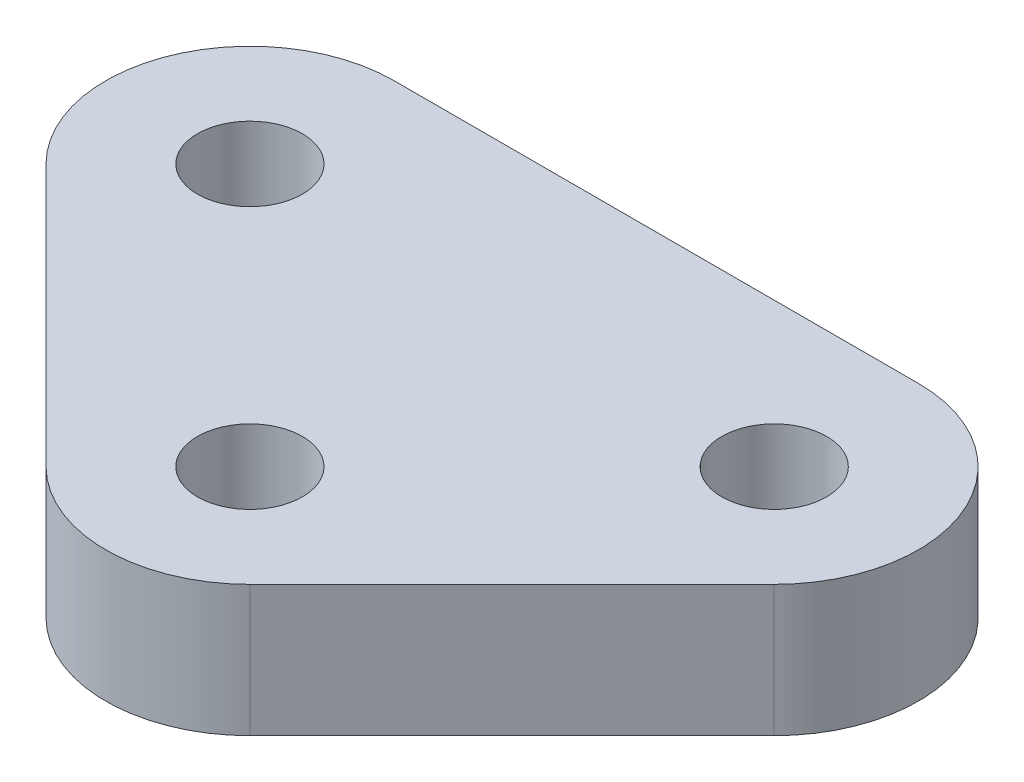
ISO-10303-21;
HEADER;
FILE_DESCRIPTION(('STEP AP214'),'2;1');
FILE_NAME('part.step','',(''),(''),'','','');
FILE_SCHEMA(('AUTOMOTIVE_DESIGN { 1 0 10303 214 1 1 1 1 }'));
ENDSEC;
DATA;
#1=APPLICATION_CONTEXT('core data for automotive mechanical design processes');
#2=APPLICATION_PROTOCOL_DEFINITION('international standard','automotive_design',2000,#1);
#3=PRODUCT_CONTEXT('',#1,'mechanical');
#4=PRODUCT('Part','Part','',(#3));
#5=PRODUCT_RELATED_PRODUCT_CATEGORY('part','',(#4));
#6=PRODUCT_DEFINITION_FORMATION('','',#4);
#7=PRODUCT_DEFINITION_CONTEXT('part definition',#1,'design');
#8=PRODUCT_DEFINITION('design','',#6,#7);
#9=PRODUCT_DEFINITION_SHAPE('','',#8);
#10=(LENGTH_UNIT() NAMED_UNIT(*) SI_UNIT(.MILLI.,.METRE.));
#11=(NAMED_UNIT(*) PLANE_ANGLE_UNIT() SI_UNIT($,.RADIAN.));
#12=(NAMED_UNIT(*) SI_UNIT($,.STERADIAN.) SOLID_ANGLE_UNIT());
#13=UNCERTAINTY_MEASURE_WITH_UNIT(LENGTH_MEASURE(1.E-05),#10,'distance_accuracy_value','');
#14=(GEOMETRIC_REPRESENTATION_CONTEXT(3) GLOBAL_UNCERTAINTY_ASSIGNED_CONTEXT((#13)) GLOBAL_UNIT_ASSIGNED_CONTEXT((#10,
#11,#12)) REPRESENTATION_CONTEXT('',''));
#15=CARTESIAN_POINT('',(0.,0.,0.));
#16=DIRECTION('',(0.,0.,1.));
#17=DIRECTION('',(1.,0.,0.));
#18=AXIS2_PLACEMENT_3D('',#15,#16,#17);
#19=CARTESIAN_POINT('',(-10.,5.,0.));
#20=DIRECTION('',(0.,-1.,0.));
#21=DIRECTION('',(0.,0.,-1.));
#22=AXIS2_PLACEMENT_3D('',#19,#20,#21);
#23=PLANE('',#22);
#24=CARTESIAN_POINT('',(-10.,5.,0.));
#25=DIRECTION('',(0.,1.,0.));
#26=DIRECTION('',(0.,0.,-1.));
#27=AXIS2_PLACEMENT_3D('',#24,#25,#26);
#28=CIRCLE('',#27,5.5);
#29=CARTESIAN_POINT('',(-10.,5.,-5.5));
#30=VERTEX_POINT('',#29);
#31=CARTESIAN_POINT('',(-13.889087296526,5.,3.88908729652601));
#32=VERTEX_POINT('',#31);
#33=EDGE_CURVE('E131',#30,#32,#28,.T.);
#34=ORIENTED_EDGE('',*,*,#33,.T.);
#35=DIRECTION('',(0.707106781186547,0.,0.707106781186548));
#36=VECTOR('',#35,1.);
#37=CARTESIAN_POINT('',(-3.88908729652601,5.,13.889087296526));
#38=LINE('',#37,#36);
#39=CARTESIAN_POINT('',(-3.88908729652601,5.,13.889087296526));
#40=VERTEX_POINT('',#39);
#41=EDGE_CURVE('E89',#32,#40,#38,.T.);
#42=ORIENTED_EDGE('',*,*,#41,.T.);
#43=CARTESIAN_POINT('',(0.,5.,10.));
#44=DIRECTION('',(0.,1.,0.));
#45=DIRECTION('',(0.,0.,-1.));
#46=AXIS2_PLACEMENT_3D('',#43,#44,#45);
#47=CIRCLE('',#46,5.5);
#48=CARTESIAN_POINT('',(3.88908729652601,5.,13.889087296526));
#49=VERTEX_POINT('',#48);
#50=EDGE_CURVE('E102',#40,#49,#47,.T.);
#51=ORIENTED_EDGE('',*,*,#50,.T.);
#52=DIRECTION('',(0.707106781186547,0.,-0.707106781186548));
#53=VECTOR('',#52,1.);
#54=CARTESIAN_POINT('',(13.889087296526,5.,3.88908729652601));
#55=LINE('',#54,#53);
#56=CARTESIAN_POINT('',(13.889087296526,5.,3.88908729652601));
#57=VERTEX_POINT('',#56);
#58=EDGE_CURVE('E96',#49,#57,#55,.T.);
#59=ORIENTED_EDGE('',*,*,#58,.T.);
#60=CARTESIAN_POINT('',(10.,5.,0.));
#61=DIRECTION('',(0.,1.,0.));
#62=DIRECTION('',(0.,0.,-1.));
#63=AXIS2_PLACEMENT_3D('',#60,#61,#62);
#64=CIRCLE('',#63,5.5);
#65=CARTESIAN_POINT('',(10.,5.,-5.5));
#66=VERTEX_POINT('',#65);
#67=EDGE_CURVE('E100',#57,#66,#64,.T.);
#68=ORIENTED_EDGE('',*,*,#67,.T.);
#69=DIRECTION('',(-1.,0.,0.));
#70=VECTOR('',#69,1.);
#71=CARTESIAN_POINT('',(-10.,5.,-5.5));
#72=LINE('',#71,#70);
#73=EDGE_CURVE('E52',#66,#30,#72,.T.);
#74=ORIENTED_EDGE('',*,*,#73,.T.);
#75=EDGE_LOOP('',(#34,#42,#51,#59,#68,#74));
#76=FACE_BOUND('',#75,.T.);
#77=CARTESIAN_POINT('',(-10.,5.,0.));
#78=DIRECTION('',(0.,1.,0.));
#79=DIRECTION('',(0.,0.,1.));
#80=AXIS2_PLACEMENT_3D('',#77,#78,#79);
#81=CIRCLE('',#80,2.);
#82=CARTESIAN_POINT('',(-10.,5.,2.));
#83=VERTEX_POINT('',#82);
#84=EDGE_CURVE('E124',#83,#83,#81,.T.);
#85=ORIENTED_EDGE('',*,*,#84,.F.);
#86=EDGE_LOOP('',(#85));
#87=FACE_BOUND('',#86,.T.);
#88=CARTESIAN_POINT('',(10.,5.,0.));
#89=DIRECTION('',(0.,1.,0.));
#90=DIRECTION('',(0.,0.,1.));
#91=AXIS2_PLACEMENT_3D('',#88,#89,#90);
#92=CIRCLE('',#91,2.);
#93=CARTESIAN_POINT('',(10.,5.,2.));
#94=VERTEX_POINT('',#93);
#95=EDGE_CURVE('E185',#94,#94,#92,.T.);
#96=ORIENTED_EDGE('',*,*,#95,.F.);
#97=EDGE_LOOP('',(#96));
#98=FACE_BOUND('',#97,.T.);
#99=CARTESIAN_POINT('',(0.,5.,10.));
#100=DIRECTION('',(0.,1.,0.));
#101=DIRECTION('',(0.,0.,1.));
#102=AXIS2_PLACEMENT_3D('',#99,#100,#101);
#103=CIRCLE('',#102,2.);
#104=CARTESIAN_POINT('',(0.,5.,12.));
#105=VERTEX_POINT('',#104);
#106=EDGE_CURVE('E176',#105,#105,#103,.T.);
#107=ORIENTED_EDGE('',*,*,#106,.F.);
#108=EDGE_LOOP('',(#107));
#109=FACE_BOUND('',#108,.T.);
#110=ADVANCED_FACE('F35',(#76,#87,#98,#109),#23,.F.);
#111=CARTESIAN_POINT('',(-10.,0.,0.));
#112=DIRECTION('',(0.,-1.,0.));
#113=DIRECTION('',(0.,0.,-1.));
#114=AXIS2_PLACEMENT_3D('',#111,#112,#113);
#115=PLANE('',#114);
#116=CARTESIAN_POINT('',(10.,0.,0.));
#117=DIRECTION('',(0.,1.,0.));
#118=DIRECTION('',(0.,0.,1.));
#119=AXIS2_PLACEMENT_3D('',#116,#117,#118);
#120=CIRCLE('',#119,2.);
#121=CARTESIAN_POINT('',(10.,0.,2.));
#122=VERTEX_POINT('',#121);
#123=EDGE_CURVE('E182',#122,#122,#120,.T.);
#124=ORIENTED_EDGE('',*,*,#123,.T.);
#125=EDGE_LOOP('',(#124));
#126=FACE_BOUND('',#125,.T.);
#127=CARTESIAN_POINT('',(-10.,0.,0.));
#128=DIRECTION('',(0.,1.,0.));
#129=DIRECTION('',(0.,0.,-1.));
#130=AXIS2_PLACEMENT_3D('',#127,#128,#129);
#131=CIRCLE('',#130,5.5);
#132=CARTESIAN_POINT('',(-10.,0.,-5.5));
#133=VERTEX_POINT('',#132);
#134=CARTESIAN_POINT('',(-13.889087296526,0.,3.88908729652601));
#135=VERTEX_POINT('',#134);
#136=EDGE_CURVE('E120',#133,#135,#131,.T.);
#137=ORIENTED_EDGE('',*,*,#136,.F.);
#138=DIRECTION('',(-1.,0.,0.));
#139=VECTOR('',#138,1.);
#140=CARTESIAN_POINT('',(-10.,0.,-5.5));
#141=LINE('',#140,#139);
#142=CARTESIAN_POINT('',(10.,0.,-5.5));
#143=VERTEX_POINT('',#142);
#144=EDGE_CURVE('E81',#143,#133,#141,.T.);
#145=ORIENTED_EDGE('',*,*,#144,.F.);
#146=CARTESIAN_POINT('',(10.,0.,0.));
#147=DIRECTION('',(0.,1.,0.));
#148=DIRECTION('',(0.,0.,-1.));
#149=AXIS2_PLACEMENT_3D('',#146,#147,#148);
#150=CIRCLE('',#149,5.5);
#151=CARTESIAN_POINT('',(13.889087296526,0.,3.88908729652601));
#152=VERTEX_POINT('',#151);
#153=EDGE_CURVE('E75',#152,#143,#150,.T.);
#154=ORIENTED_EDGE('',*,*,#153,.F.);
#155=DIRECTION('',(0.707106781186547,0.,-0.707106781186548));
#156=VECTOR('',#155,1.);
#157=CARTESIAN_POINT('',(13.889087296526,0.,3.88908729652601));
#158=LINE('',#157,#156);
#159=CARTESIAN_POINT('',(3.88908729652601,0.,13.889087296526));
#160=VERTEX_POINT('',#159);
#161=EDGE_CURVE('E110',#160,#152,#158,.T.);
#162=ORIENTED_EDGE('',*,*,#161,.F.);
#163=CARTESIAN_POINT('',(0.,0.,10.));
#164=DIRECTION('',(0.,1.,0.));
#165=DIRECTION('',(0.,0.,-1.));
#166=AXIS2_PLACEMENT_3D('',#163,#164,#165);
#167=CIRCLE('',#166,5.5);
#168=CARTESIAN_POINT('',(-3.88908729652601,0.,13.889087296526));
#169=VERTEX_POINT('',#168);
#170=EDGE_CURVE('E126',#169,#160,#167,.T.);
#171=ORIENTED_EDGE('',*,*,#170,.F.);
#172=DIRECTION('',(0.707106781186547,0.,0.707106781186548));
#173=VECTOR('',#172,1.);
#174=CARTESIAN_POINT('',(-3.88908729652601,0.,13.889087296526));
#175=LINE('',#174,#173);
#176=EDGE_CURVE('E123',#135,#169,#175,.T.);
#177=ORIENTED_EDGE('',*,*,#176,.F.);
#178=EDGE_LOOP('',(#137,#145,#154,#162,#171,#177));
#179=FACE_BOUND('',#178,.T.);
#180=CARTESIAN_POINT('',(-10.,0.,0.));
#181=DIRECTION('',(0.,1.,0.));
#182=DIRECTION('',(0.,0.,1.));
#183=AXIS2_PLACEMENT_3D('',#180,#181,#182);
#184=CIRCLE('',#183,2.);
#185=CARTESIAN_POINT('',(-10.,0.,2.));
#186=VERTEX_POINT('',#185);
#187=EDGE_CURVE('E188',#186,#186,#184,.T.);
#188=ORIENTED_EDGE('',*,*,#187,.T.);
#189=EDGE_LOOP('',(#188));
#190=FACE_BOUND('',#189,.T.);
#191=CARTESIAN_POINT('',(0.,0.,10.));
#192=DIRECTION('',(0.,1.,0.));
#193=DIRECTION('',(0.,0.,1.));
#194=AXIS2_PLACEMENT_3D('',#191,#192,#193);
#195=CIRCLE('',#194,2.);
#196=CARTESIAN_POINT('',(0.,0.,12.));
#197=VERTEX_POINT('',#196);
#198=EDGE_CURVE('E179',#197,#197,#195,.T.);
#199=ORIENTED_EDGE('',*,*,#198,.T.);
#200=EDGE_LOOP('',(#199));
#201=FACE_BOUND('',#200,.T.);
#202=ADVANCED_FACE('F140',(#126,#179,#190,#201),#115,.T.);
#203=CARTESIAN_POINT('',(-10.,5.,0.));
#204=DIRECTION('',(0.,-1.,0.));
#205=DIRECTION('',(0.,0.,-1.));
#206=AXIS2_PLACEMENT_3D('',#203,#204,#205);
#207=CYLINDRICAL_SURFACE('',#206,5.5);
#208=ORIENTED_EDGE('',*,*,#136,.T.);
#209=DIRECTION('',(0.,-1.,0.));
#210=VECTOR('',#209,1.);
#211=CARTESIAN_POINT('',(-13.889087296526,5.,3.88908729652601));
#212=LINE('',#211,#210);
#213=EDGE_CURVE('E11',#32,#135,#212,.T.);
#214=ORIENTED_EDGE('',*,*,#213,.F.);
#215=ORIENTED_EDGE('',*,*,#33,.F.);
#216=DIRECTION('',(0.,-1.,0.));
#217=VECTOR('',#216,1.);
#218=CARTESIAN_POINT('',(-10.,5.,-5.5));
#219=LINE('',#218,#217);
#220=EDGE_CURVE('E116',#30,#133,#219,.T.);
#221=ORIENTED_EDGE('',*,*,#220,.T.);
#222=EDGE_LOOP('',(#208,#214,#215,#221));
#223=FACE_BOUND('',#222,.T.);
#224=ADVANCED_FACE('F37',(#223),#207,.T.);
#225=CARTESIAN_POINT('',(-3.88908729652601,5.,13.889087296526));
#226=DIRECTION('',(0.707106781186548,0.,-0.707106781186547));
#227=DIRECTION('',(-0.707106781186547,0.,-0.707106781186548));
#228=AXIS2_PLACEMENT_3D('',#225,#226,#227);
#229=PLANE('',#228);
#230=ORIENTED_EDGE('',*,*,#176,.T.);
#231=DIRECTION('',(0.,-1.,0.));
#232=VECTOR('',#231,1.);
#233=CARTESIAN_POINT('',(-3.88908729652601,5.,13.889087296526));
#234=LINE('',#233,#232);
#235=EDGE_CURVE('E44',#40,#169,#234,.T.);
#236=ORIENTED_EDGE('',*,*,#235,.F.);
#237=ORIENTED_EDGE('',*,*,#41,.F.);
#238=ORIENTED_EDGE('',*,*,#213,.T.);
#239=EDGE_LOOP('',(#230,#236,#237,#238));
#240=FACE_BOUND('',#239,.T.);
#241=ADVANCED_FACE('F239',(#240),#229,.F.);
#242=CARTESIAN_POINT('',(0.,5.,10.));
#243=DIRECTION('',(0.,-1.,0.));
#244=DIRECTION('',(0.,0.,-1.));
#245=AXIS2_PLACEMENT_3D('',#242,#243,#244);
#246=CYLINDRICAL_SURFACE('',#245,5.5);
#247=ORIENTED_EDGE('',*,*,#170,.T.);
#248=DIRECTION('',(0.,-1.,0.));
#249=VECTOR('',#248,1.);
#250=CARTESIAN_POINT('',(3.88908729652601,5.,13.889087296526));
#251=LINE('',#250,#249);
#252=EDGE_CURVE('E111',#49,#160,#251,.T.);
#253=ORIENTED_EDGE('',*,*,#252,.F.);
#254=ORIENTED_EDGE('',*,*,#50,.F.);
#255=ORIENTED_EDGE('',*,*,#235,.T.);
#256=EDGE_LOOP('',(#247,#253,#254,#255));
#257=FACE_BOUND('',#256,.T.);
#258=ADVANCED_FACE('F137',(#257),#246,.T.);
#259=CARTESIAN_POINT('',(13.889087296526,5.,3.88908729652601));
#260=DIRECTION('',(-0.707106781186548,0.,-0.707106781186547));
#261=DIRECTION('',(-0.707106781186547,0.,0.707106781186548));
#262=AXIS2_PLACEMENT_3D('',#259,#260,#261);
#263=PLANE('',#262);
#264=ORIENTED_EDGE('',*,*,#161,.T.);
#265=DIRECTION('',(0.,-1.,0.));
#266=VECTOR('',#265,1.);
#267=CARTESIAN_POINT('',(13.889087296526,5.,3.88908729652601));
#268=LINE('',#267,#266);
#269=EDGE_CURVE('E107',#57,#152,#268,.T.);
#270=ORIENTED_EDGE('',*,*,#269,.F.);
#271=ORIENTED_EDGE('',*,*,#58,.F.);
#272=ORIENTED_EDGE('',*,*,#252,.T.);
#273=EDGE_LOOP('',(#264,#270,#271,#272));
#274=FACE_BOUND('',#273,.T.);
#275=ADVANCED_FACE('F108',(#274),#263,.F.);
#276=CARTESIAN_POINT('',(10.,5.,0.));
#277=DIRECTION('',(0.,-1.,0.));
#278=DIRECTION('',(0.,0.,-1.));
#279=AXIS2_PLACEMENT_3D('',#276,#277,#278);
#280=CYLINDRICAL_SURFACE('',#279,5.5);
#281=ORIENTED_EDGE('',*,*,#153,.T.);
#282=DIRECTION('',(0.,-1.,0.));
#283=VECTOR('',#282,1.);
#284=CARTESIAN_POINT('',(10.,5.,-5.5));
#285=LINE('',#284,#283);
#286=EDGE_CURVE('E112',#66,#143,#285,.T.);
#287=ORIENTED_EDGE('',*,*,#286,.F.);
#288=ORIENTED_EDGE('',*,*,#67,.F.);
#289=ORIENTED_EDGE('',*,*,#269,.T.);
#290=EDGE_LOOP('',(#281,#287,#288,#289));
#291=FACE_BOUND('',#290,.T.);
#292=ADVANCED_FACE('F114',(#291),#280,.T.);
#293=CARTESIAN_POINT('',(-10.,5.,-5.5));
#294=DIRECTION('',(0.,0.,1.));
#295=DIRECTION('',(1.,0.,0.));
#296=AXIS2_PLACEMENT_3D('',#293,#294,#295);
#297=PLANE('',#296);
#298=ORIENTED_EDGE('',*,*,#144,.T.);
#299=ORIENTED_EDGE('',*,*,#220,.F.);
#300=ORIENTED_EDGE('',*,*,#73,.F.);
#301=ORIENTED_EDGE('',*,*,#286,.T.);
#302=EDGE_LOOP('',(#298,#299,#300,#301));
#303=FACE_BOUND('',#302,.T.);
#304=ADVANCED_FACE('F145',(#303),#297,.F.);
#305=CARTESIAN_POINT('',(-10.,5.,0.));
#306=DIRECTION('',(0.,-1.,0.));
#307=DIRECTION('',(0.,0.,-1.));
#308=AXIS2_PLACEMENT_3D('',#305,#306,#307);
#309=CYLINDRICAL_SURFACE('',#308,2.);
#310=ORIENTED_EDGE('',*,*,#84,.T.);
#311=EDGE_LOOP('',(#310));
#312=FACE_BOUND('',#311,.T.);
#313=ORIENTED_EDGE('',*,*,#187,.F.);
#314=EDGE_LOOP('',(#313));
#315=FACE_BOUND('',#314,.T.);
#316=ADVANCED_FACE('F147',(#312,#315),#309,.F.);
#317=CARTESIAN_POINT('',(10.,5.,0.));
#318=DIRECTION('',(0.,-1.,0.));
#319=DIRECTION('',(0.,0.,-1.));
#320=AXIS2_PLACEMENT_3D('',#317,#318,#319);
#321=CYLINDRICAL_SURFACE('',#320,2.);
#322=ORIENTED_EDGE('',*,*,#95,.T.);
#323=EDGE_LOOP('',(#322));
#324=FACE_BOUND('',#323,.T.);
#325=ORIENTED_EDGE('',*,*,#123,.F.);
#326=EDGE_LOOP('',(#325));
#327=FACE_BOUND('',#326,.T.);
#328=ADVANCED_FACE('F153',(#324,#327),#321,.F.);
#329=CARTESIAN_POINT('',(0.,5.,10.));
#330=DIRECTION('',(0.,-1.,0.));
#331=DIRECTION('',(0.,0.,-1.));
#332=AXIS2_PLACEMENT_3D('',#329,#330,#331);
#333=CYLINDRICAL_SURFACE('',#332,2.);
#334=ORIENTED_EDGE('',*,*,#106,.T.);
#335=EDGE_LOOP('',(#334));
#336=FACE_BOUND('',#335,.T.);
#337=ORIENTED_EDGE('',*,*,#198,.F.);
#338=EDGE_LOOP('',(#337));
#339=FACE_BOUND('',#338,.T.);
#340=ADVANCED_FACE('F167',(#336,#339),#333,.F.);
#341=CLOSED_SHELL('',(#110,#202,#224,#241,#258,#275,#292,#304,#316,#328,#340));
#342=MANIFOLD_SOLID_BREP('B2',#341);
#343=ADVANCED_BREP_SHAPE_REPRESENTATION('',(#18,#342),#14);
#344=SHAPE_DEFINITION_REPRESENTATION(#9,#343);
ENDSEC;
END-ISO-10303-21;
